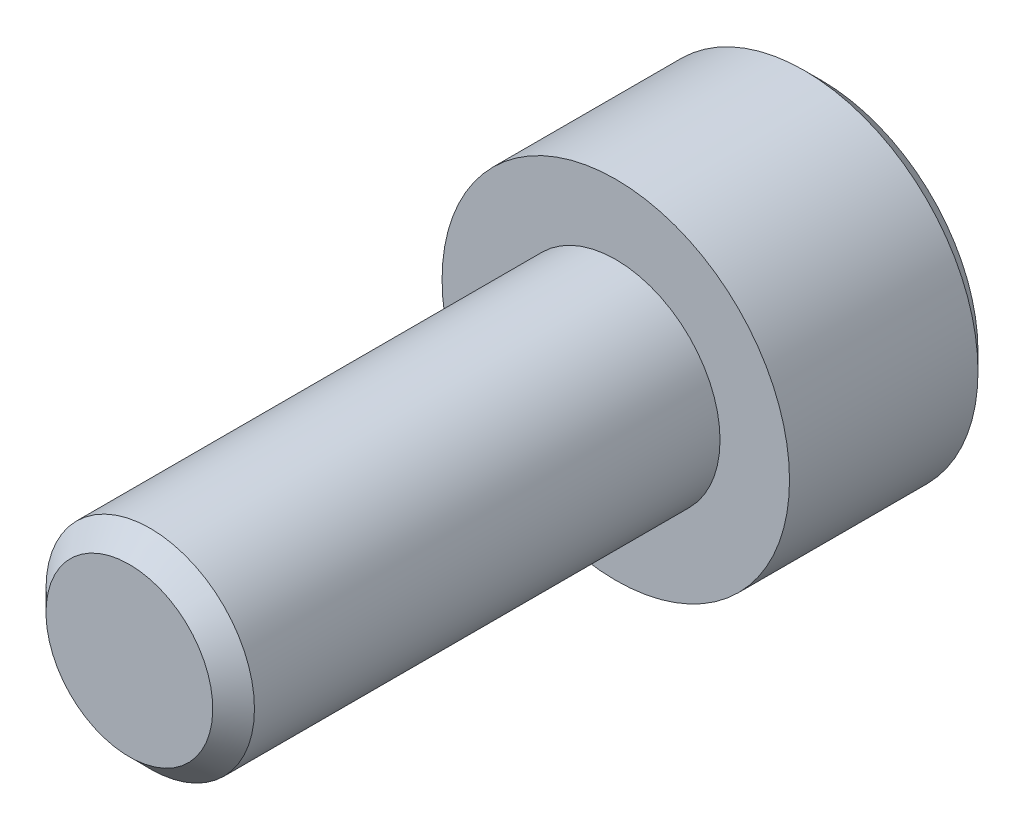
ISO-10303-21;
HEADER;
FILE_DESCRIPTION(('STEP AP214'),'2;1');
FILE_NAME('part.step','',(''),(''),'','','');
FILE_SCHEMA(('AUTOMOTIVE_DESIGN { 1 0 10303 214 1 1 1 1 }'));
ENDSEC;
DATA;
#1=APPLICATION_CONTEXT('core data for automotive mechanical design processes');
#2=APPLICATION_PROTOCOL_DEFINITION('international standard','automotive_design',2000,#1);
#3=PRODUCT_CONTEXT('',#1,'mechanical');
#4=PRODUCT('Part','Part','',(#3));
#5=PRODUCT_RELATED_PRODUCT_CATEGORY('part','',(#4));
#6=PRODUCT_DEFINITION_FORMATION('','',#4);
#7=PRODUCT_DEFINITION_CONTEXT('part definition',#1,'design');
#8=PRODUCT_DEFINITION('design','',#6,#7);
#9=PRODUCT_DEFINITION_SHAPE('','',#8);
#10=(LENGTH_UNIT() NAMED_UNIT(*) SI_UNIT(.MILLI.,.METRE.));
#11=(NAMED_UNIT(*) PLANE_ANGLE_UNIT() SI_UNIT($,.RADIAN.));
#12=(NAMED_UNIT(*) SI_UNIT($,.STERADIAN.) SOLID_ANGLE_UNIT());
#13=UNCERTAINTY_MEASURE_WITH_UNIT(LENGTH_MEASURE(1.E-05),#10,'distance_accuracy_value','');
#14=(GEOMETRIC_REPRESENTATION_CONTEXT(3) GLOBAL_UNCERTAINTY_ASSIGNED_CONTEXT((#13)) GLOBAL_UNIT_ASSIGNED_CONTEXT((#10,
#11,#12)) REPRESENTATION_CONTEXT('',''));
#15=CARTESIAN_POINT('',(0.,0.,0.));
#16=DIRECTION('',(0.,0.,1.));
#17=DIRECTION('',(1.,0.,0.));
#18=AXIS2_PLACEMENT_3D('',#15,#16,#17);
#19=CARTESIAN_POINT('',(0.,0.,-2.925));
#20=DIRECTION('',(0.,0.,1.));
#21=DIRECTION('',(1.,0.,0.));
#22=AXIS2_PLACEMENT_3D('',#19,#20,#21);
#23=PLANE('',#22);
#24=DIRECTION('',(0.,1.,0.));
#25=VECTOR('',#24,1.);
#26=CARTESIAN_POINT('',(2.5,1.44337567297406,-2.925));
#27=LINE('',#26,#25);
#28=CARTESIAN_POINT('',(2.5,1.44337567297406,-2.925));
#29=VERTEX_POINT('',#28);
#30=CARTESIAN_POINT('',(2.5,-1.44337567297406,-2.925));
#31=VERTEX_POINT('',#30);
#32=EDGE_CURVE('E69',#29,#31,#27,.F.);
#33=ORIENTED_EDGE('',*,*,#32,.T.);
#34=DIRECTION('',(0.866025403784439,0.499999999999999,0.));
#35=VECTOR('',#34,1.);
#36=CARTESIAN_POINT('',(2.5,-1.44337567297406,-2.925));
#37=LINE('',#36,#35);
#38=CARTESIAN_POINT('',(0.,-2.88675134594813,-2.925));
#39=VERTEX_POINT('',#38);
#40=EDGE_CURVE('E98',#31,#39,#37,.F.);
#41=ORIENTED_EDGE('',*,*,#40,.T.);
#42=DIRECTION('',(0.866025403784438,-0.5,0.));
#43=VECTOR('',#42,1.);
#44=CARTESIAN_POINT('',(0.,-2.88675134594813,-2.925));
#45=LINE('',#44,#43);
#46=CARTESIAN_POINT('',(-2.5,-1.44337567297406,-2.925));
#47=VERTEX_POINT('',#46);
#48=EDGE_CURVE('E153',#39,#47,#45,.F.);
#49=ORIENTED_EDGE('',*,*,#48,.T.);
#50=DIRECTION('',(0.,1.,0.));
#51=VECTOR('',#50,1.);
#52=CARTESIAN_POINT('',(-2.5,-1.44337567297406,-2.925));
#53=LINE('',#52,#51);
#54=CARTESIAN_POINT('',(-2.5,1.44337567297407,-2.925));
#55=VERTEX_POINT('',#54);
#56=EDGE_CURVE('E146',#47,#55,#53,.T.);
#57=ORIENTED_EDGE('',*,*,#56,.T.);
#58=DIRECTION('',(-0.866025403784439,-0.5,0.));
#59=VECTOR('',#58,1.);
#60=CARTESIAN_POINT('',(-2.5,1.44337567297407,-2.925));
#61=LINE('',#60,#59);
#62=CARTESIAN_POINT('',(0.,2.88675134594813,-2.925));
#63=VERTEX_POINT('',#62);
#64=EDGE_CURVE('E75',#55,#63,#61,.F.);
#65=ORIENTED_EDGE('',*,*,#64,.T.);
#66=DIRECTION('',(-0.866025403784439,0.5,0.));
#67=VECTOR('',#66,1.);
#68=CARTESIAN_POINT('',(0.,2.88675134594813,-2.925));
#69=LINE('',#68,#67);
#70=EDGE_CURVE('E72',#63,#29,#69,.F.);
#71=ORIENTED_EDGE('',*,*,#70,.T.);
#72=EDGE_LOOP('',(#33,#41,#49,#57,#65,#71));
#73=FACE_BOUND('',#72,.T.);
#74=ADVANCED_FACE('F17',(#73),#23,.F.);
#75=CARTESIAN_POINT('',(0.,2.88675134594813,-5.925));
#76=DIRECTION('',(0.5,0.866025403784439,0.));
#77=DIRECTION('',(-0.866025403784439,0.5,0.));
#78=AXIS2_PLACEMENT_3D('',#75,#76,#77);
#79=PLANE('',#78);
#80=ORIENTED_EDGE('',*,*,#70,.F.);
#81=DIRECTION('',(0.,0.,1.));
#82=VECTOR('',#81,1.);
#83=CARTESIAN_POINT('',(0.,2.88675134594813,-5.925));
#84=LINE('',#83,#82);
#85=CARTESIAN_POINT('',(0.,2.88675134594813,-5.925));
#86=VERTEX_POINT('',#85);
#87=EDGE_CURVE('E138',#63,#86,#84,.F.);
#88=ORIENTED_EDGE('',*,*,#87,.T.);
#89=DIRECTION('',(0.866025403784438,-0.500000000000001,0.));
#90=VECTOR('',#89,1.);
#91=CARTESIAN_POINT('',(0.,2.88675134594813,-5.925));
#92=LINE('',#91,#90);
#93=CARTESIAN_POINT('',(2.5,1.44337567297406,-5.925));
#94=VERTEX_POINT('',#93);
#95=EDGE_CURVE('E84',#86,#94,#92,.T.);
#96=ORIENTED_EDGE('',*,*,#95,.T.);
#97=DIRECTION('',(0.,0.,-1.));
#98=VECTOR('',#97,1.);
#99=CARTESIAN_POINT('',(2.5,1.44337567297406,-5.925));
#100=LINE('',#99,#98);
#101=EDGE_CURVE('E79',#94,#29,#100,.F.);
#102=ORIENTED_EDGE('',*,*,#101,.T.);
#103=EDGE_LOOP('',(#80,#88,#96,#102));
#104=FACE_BOUND('',#103,.T.);
#105=ADVANCED_FACE('F82',(#104),#79,.F.);
#106=CARTESIAN_POINT('',(2.5,1.44337567297406,-5.925));
#107=DIRECTION('',(1.,0.,0.));
#108=DIRECTION('',(0.,0.,-1.));
#109=AXIS2_PLACEMENT_3D('',#106,#107,#108);
#110=PLANE('',#109);
#111=ORIENTED_EDGE('',*,*,#32,.F.);
#112=ORIENTED_EDGE('',*,*,#101,.F.);
#113=DIRECTION('',(0.,1.,0.));
#114=VECTOR('',#113,1.);
#115=CARTESIAN_POINT('',(2.5,0.,-5.925));
#116=LINE('',#115,#114);
#117=CARTESIAN_POINT('',(2.5,-1.44337567297406,-5.925));
#118=VERTEX_POINT('',#117);
#119=EDGE_CURVE('E133',#94,#118,#116,.F.);
#120=ORIENTED_EDGE('',*,*,#119,.T.);
#121=DIRECTION('',(0.,0.,1.));
#122=VECTOR('',#121,1.);
#123=CARTESIAN_POINT('',(2.5,-1.44337567297406,-5.925));
#124=LINE('',#123,#122);
#125=EDGE_CURVE('E91',#118,#31,#124,.T.);
#126=ORIENTED_EDGE('',*,*,#125,.T.);
#127=EDGE_LOOP('',(#111,#112,#120,#126));
#128=FACE_BOUND('',#127,.T.);
#129=ADVANCED_FACE('F89',(#128),#110,.F.);
#130=CARTESIAN_POINT('',(2.5,-1.44337567297406,-5.925));
#131=DIRECTION('',(0.499999999999999,-0.866025403784439,0.));
#132=DIRECTION('',(0.866025403784439,0.499999999999999,0.));
#133=AXIS2_PLACEMENT_3D('',#130,#131,#132);
#134=PLANE('',#133);
#135=ORIENTED_EDGE('',*,*,#40,.F.);
#136=ORIENTED_EDGE('',*,*,#125,.F.);
#137=DIRECTION('',(-0.866025403784438,-0.500000000000001,0.));
#138=VECTOR('',#137,1.);
#139=CARTESIAN_POINT('',(2.5,-1.44337567297406,-5.925));
#140=LINE('',#139,#138);
#141=CARTESIAN_POINT('',(0.,-2.88675134594813,-5.925));
#142=VERTEX_POINT('',#141);
#143=EDGE_CURVE('E130',#118,#142,#140,.T.);
#144=ORIENTED_EDGE('',*,*,#143,.T.);
#145=DIRECTION('',(0.,0.,1.));
#146=VECTOR('',#145,1.);
#147=CARTESIAN_POINT('',(0.,-2.88675134594813,-5.925));
#148=LINE('',#147,#146);
#149=EDGE_CURVE('E156',#142,#39,#148,.T.);
#150=ORIENTED_EDGE('',*,*,#149,.T.);
#151=EDGE_LOOP('',(#135,#136,#144,#150));
#152=FACE_BOUND('',#151,.T.);
#153=ADVANCED_FACE('F161',(#152),#134,.F.);
#154=CARTESIAN_POINT('',(0.,-2.88675134594813,-5.925));
#155=DIRECTION('',(-0.5,-0.866025403784438,0.));
#156=DIRECTION('',(0.866025403784438,-0.5,0.));
#157=AXIS2_PLACEMENT_3D('',#154,#155,#156);
#158=PLANE('',#157);
#159=ORIENTED_EDGE('',*,*,#48,.F.);
#160=ORIENTED_EDGE('',*,*,#149,.F.);
#161=DIRECTION('',(-0.866025403784438,0.500000000000002,0.));
#162=VECTOR('',#161,1.);
#163=CARTESIAN_POINT('',(0.,-2.88675134594813,-5.925));
#164=LINE('',#163,#162);
#165=CARTESIAN_POINT('',(-2.5,-1.44337567297406,-5.925));
#166=VERTEX_POINT('',#165);
#167=EDGE_CURVE('E127',#142,#166,#164,.T.);
#168=ORIENTED_EDGE('',*,*,#167,.T.);
#169=DIRECTION('',(0.,0.,1.));
#170=VECTOR('',#169,1.);
#171=CARTESIAN_POINT('',(-2.5,-1.44337567297406,-5.925));
#172=LINE('',#171,#170);
#173=EDGE_CURVE('E149',#166,#47,#172,.T.);
#174=ORIENTED_EDGE('',*,*,#173,.T.);
#175=EDGE_LOOP('',(#159,#160,#168,#174));
#176=FACE_BOUND('',#175,.T.);
#177=ADVANCED_FACE('F165',(#176),#158,.F.);
#178=CARTESIAN_POINT('',(-2.5,-1.44337567297406,-5.925));
#179=DIRECTION('',(-1.,0.,0.));
#180=DIRECTION('',(0.,0.,1.));
#181=AXIS2_PLACEMENT_3D('',#178,#179,#180);
#182=PLANE('',#181);
#183=ORIENTED_EDGE('',*,*,#56,.F.);
#184=ORIENTED_EDGE('',*,*,#173,.F.);
#185=DIRECTION('',(0.,1.,0.));
#186=VECTOR('',#185,1.);
#187=CARTESIAN_POINT('',(-2.5,0.,-5.925));
#188=LINE('',#187,#186);
#189=CARTESIAN_POINT('',(-2.5,1.44337567297407,-5.925));
#190=VERTEX_POINT('',#189);
#191=EDGE_CURVE('E36',#166,#190,#188,.T.);
#192=ORIENTED_EDGE('',*,*,#191,.T.);
#193=DIRECTION('',(0.,0.,1.));
#194=VECTOR('',#193,1.);
#195=CARTESIAN_POINT('',(-2.5,1.44337567297407,-5.925));
#196=LINE('',#195,#194);
#197=EDGE_CURVE('E143',#190,#55,#196,.T.);
#198=ORIENTED_EDGE('',*,*,#197,.T.);
#199=EDGE_LOOP('',(#183,#184,#192,#198));
#200=FACE_BOUND('',#199,.T.);
#201=ADVANCED_FACE('F167',(#200),#182,.F.);
#202=CARTESIAN_POINT('',(-2.5,1.44337567297407,-5.925));
#203=DIRECTION('',(-0.5,0.866025403784439,0.));
#204=DIRECTION('',(-0.866025403784439,-0.5,0.));
#205=AXIS2_PLACEMENT_3D('',#202,#203,#204);
#206=PLANE('',#205);
#207=ORIENTED_EDGE('',*,*,#64,.F.);
#208=ORIENTED_EDGE('',*,*,#197,.F.);
#209=DIRECTION('',(0.866025403784438,0.500000000000001,0.));
#210=VECTOR('',#209,1.);
#211=CARTESIAN_POINT('',(-2.5,1.44337567297406,-5.925));
#212=LINE('',#211,#210);
#213=EDGE_CURVE('E120',#190,#86,#212,.T.);
#214=ORIENTED_EDGE('',*,*,#213,.T.);
#215=ORIENTED_EDGE('',*,*,#87,.F.);
#216=EDGE_LOOP('',(#207,#208,#214,#215));
#217=FACE_BOUND('',#216,.T.);
#218=ADVANCED_FACE('F170',(#217),#206,.F.);
#219=CARTESIAN_POINT('',(0.,0.,-5.925));
#220=DIRECTION('',(0.,0.,1.));
#221=DIRECTION('',(1.,0.,0.));
#222=AXIS2_PLACEMENT_3D('',#219,#220,#221);
#223=PLANE('',#222);
#224=ORIENTED_EDGE('',*,*,#191,.F.);
#225=ORIENTED_EDGE('',*,*,#167,.F.);
#226=ORIENTED_EDGE('',*,*,#143,.F.);
#227=ORIENTED_EDGE('',*,*,#119,.F.);
#228=ORIENTED_EDGE('',*,*,#95,.F.);
#229=ORIENTED_EDGE('',*,*,#213,.F.);
#230=EDGE_LOOP('',(#224,#225,#226,#227,#228,#229));
#231=FACE_BOUND('',#230,.T.);
#232=CARTESIAN_POINT('',(0.,0.,-5.92499999999063));
#233=DIRECTION('',(0.,0.,1.));
#234=DIRECTION('',(1.,0.,0.));
#235=AXIS2_PLACEMENT_3D('',#232,#233,#234);
#236=CIRCLE('',#235,4.50000000000728);
#237=CARTESIAN_POINT('',(4.50000000000728,0.,-5.92499999999063));
#238=VERTEX_POINT('',#237);
#239=EDGE_CURVE('E20',#238,#238,#236,.T.);
#240=ORIENTED_EDGE('',*,*,#239,.F.);
#241=EDGE_LOOP('',(#240));
#242=FACE_BOUND('',#241,.T.);
#243=ADVANCED_FACE('F172',(#231,#242),#223,.F.);
#244=CARTESIAN_POINT('',(0.,0.,-5.42500000000246));
#245=DIRECTION('',(0.,0.,1.));
#246=DIRECTION('',(1.,0.,0.));
#247=AXIS2_PLACEMENT_3D('',#244,#245,#246);
#248=CONICAL_SURFACE('',#247,4.99999999999545,0.785398163397448);
#249=ORIENTED_EDGE('',*,*,#239,.T.);
#250=EDGE_LOOP('',(#249));
#251=FACE_BOUND('',#250,.T.);
#252=CARTESIAN_POINT('',(0.,0.,-5.425));
#253=DIRECTION('',(0.,0.,1.));
#254=DIRECTION('',(1.,0.,0.));
#255=AXIS2_PLACEMENT_3D('',#252,#253,#254);
#256=CIRCLE('',#255,5.);
#257=CARTESIAN_POINT('',(5.,0.,-5.425));
#258=VERTEX_POINT('',#257);
#259=EDGE_CURVE('E108',#258,#258,#256,.T.);
#260=ORIENTED_EDGE('',*,*,#259,.F.);
#261=EDGE_LOOP('',(#260));
#262=FACE_BOUND('',#261,.T.);
#263=ADVANCED_FACE('F175',(#251,#262),#248,.T.);
#264=CARTESIAN_POINT('',(0.,0.,14.));
#265=DIRECTION('',(0.,0.,1.));
#266=DIRECTION('',(1.,0.,0.));
#267=AXIS2_PLACEMENT_3D('',#264,#265,#266);
#268=PLANE('',#267);
#269=CARTESIAN_POINT('',(0.,0.,14.00000000001));
#270=DIRECTION('',(0.,0.,-1.));
#271=DIRECTION('',(0.,1.,0.));
#272=AXIS2_PLACEMENT_3D('',#269,#270,#271);
#273=CIRCLE('',#272,2.39999999996598);
#274=CARTESIAN_POINT('',(0.,2.39999999996598,14.00000000001));
#275=VERTEX_POINT('',#274);
#276=EDGE_CURVE('E105',#275,#275,#273,.T.);
#277=ORIENTED_EDGE('',*,*,#276,.F.);
#278=EDGE_LOOP('',(#277));
#279=FACE_BOUND('',#278,.T.);
#280=ADVANCED_FACE('F181',(#279),#268,.T.);
#281=CARTESIAN_POINT('',(0.,0.,-5.925));
#282=DIRECTION('',(0.,0.,1.));
#283=DIRECTION('',(1.,0.,0.));
#284=AXIS2_PLACEMENT_3D('',#281,#282,#283);
#285=CYLINDRICAL_SURFACE('',#284,5.);
#286=ORIENTED_EDGE('',*,*,#259,.T.);
#287=EDGE_LOOP('',(#286));
#288=FACE_BOUND('',#287,.T.);
#289=CARTESIAN_POINT('',(0.,0.,0.));
#290=DIRECTION('',(0.,0.,1.));
#291=DIRECTION('',(1.,0.,0.));
#292=AXIS2_PLACEMENT_3D('',#289,#290,#291);
#293=CIRCLE('',#292,5.);
#294=CARTESIAN_POINT('',(5.,0.,0.));
#295=VERTEX_POINT('',#294);
#296=EDGE_CURVE('E102',#295,#295,#293,.T.);
#297=ORIENTED_EDGE('',*,*,#296,.F.);
#298=EDGE_LOOP('',(#297));
#299=FACE_BOUND('',#298,.T.);
#300=ADVANCED_FACE('F186',(#288,#299),#285,.T.);
#301=CARTESIAN_POINT('',(0.,0.,13.4000000000469));
#302=DIRECTION('',(0.,0.,-1.));
#303=DIRECTION('',(0.,1.,0.));
#304=AXIS2_PLACEMENT_3D('',#301,#302,#303);
#305=CONICAL_SURFACE('',#304,2.99999999992906,0.785398163397448);
#306=CARTESIAN_POINT('',(0.,0.,13.4));
#307=DIRECTION('',(0.,0.,1.));
#308=DIRECTION('',(1.,0.,0.));
#309=AXIS2_PLACEMENT_3D('',#306,#307,#308);
#310=CIRCLE('',#309,3.);
#311=CARTESIAN_POINT('',(3.,0.,13.4));
#312=VERTEX_POINT('',#311);
#313=EDGE_CURVE('E27',#312,#312,#310,.F.);
#314=ORIENTED_EDGE('',*,*,#313,.F.);
#315=EDGE_LOOP('',(#314));
#316=FACE_BOUND('',#315,.T.);
#317=ORIENTED_EDGE('',*,*,#276,.T.);
#318=EDGE_LOOP('',(#317));
#319=FACE_BOUND('',#318,.T.);
#320=ADVANCED_FACE('F196',(#316,#319),#305,.T.);
#321=CARTESIAN_POINT('',(0.,0.,0.));
#322=DIRECTION('',(0.,0.,1.));
#323=DIRECTION('',(1.,0.,0.));
#324=AXIS2_PLACEMENT_3D('',#321,#322,#323);
#325=PLANE('',#324);
#326=CARTESIAN_POINT('',(0.,0.,0.));
#327=DIRECTION('',(0.,0.,1.));
#328=DIRECTION('',(1.,0.,0.));
#329=AXIS2_PLACEMENT_3D('',#326,#327,#328);
#330=CIRCLE('',#329,3.);
#331=CARTESIAN_POINT('',(3.,0.,0.));
#332=VERTEX_POINT('',#331);
#333=EDGE_CURVE('E11',#332,#332,#330,.T.);
#334=ORIENTED_EDGE('',*,*,#333,.F.);
#335=EDGE_LOOP('',(#334));
#336=FACE_BOUND('',#335,.T.);
#337=ORIENTED_EDGE('',*,*,#296,.T.);
#338=EDGE_LOOP('',(#337));
#339=FACE_BOUND('',#338,.T.);
#340=ADVANCED_FACE('F191',(#336,#339),#325,.T.);
#341=CARTESIAN_POINT('',(0.,0.,0.));
#342=DIRECTION('',(0.,0.,1.));
#343=DIRECTION('',(1.,0.,0.));
#344=AXIS2_PLACEMENT_3D('',#341,#342,#343);
#345=CYLINDRICAL_SURFACE('',#344,3.);
#346=ORIENTED_EDGE('',*,*,#333,.T.);
#347=EDGE_LOOP('',(#346));
#348=FACE_BOUND('',#347,.T.);
#349=ORIENTED_EDGE('',*,*,#313,.T.);
#350=EDGE_LOOP('',(#349));
#351=FACE_BOUND('',#350,.T.);
#352=ADVANCED_FACE('F189',(#348,#351),#345,.T.);
#353=CLOSED_SHELL('',(#74,#105,#129,#153,#177,#201,#218,#243,#263,#280,#300,#320,#340,#352));
#354=MANIFOLD_SOLID_BREP('B1',#353);
#355=ADVANCED_BREP_SHAPE_REPRESENTATION('',(#18,#354),#14);
#356=SHAPE_DEFINITION_REPRESENTATION(#9,#355);
ENDSEC;
END-ISO-10303-21;
